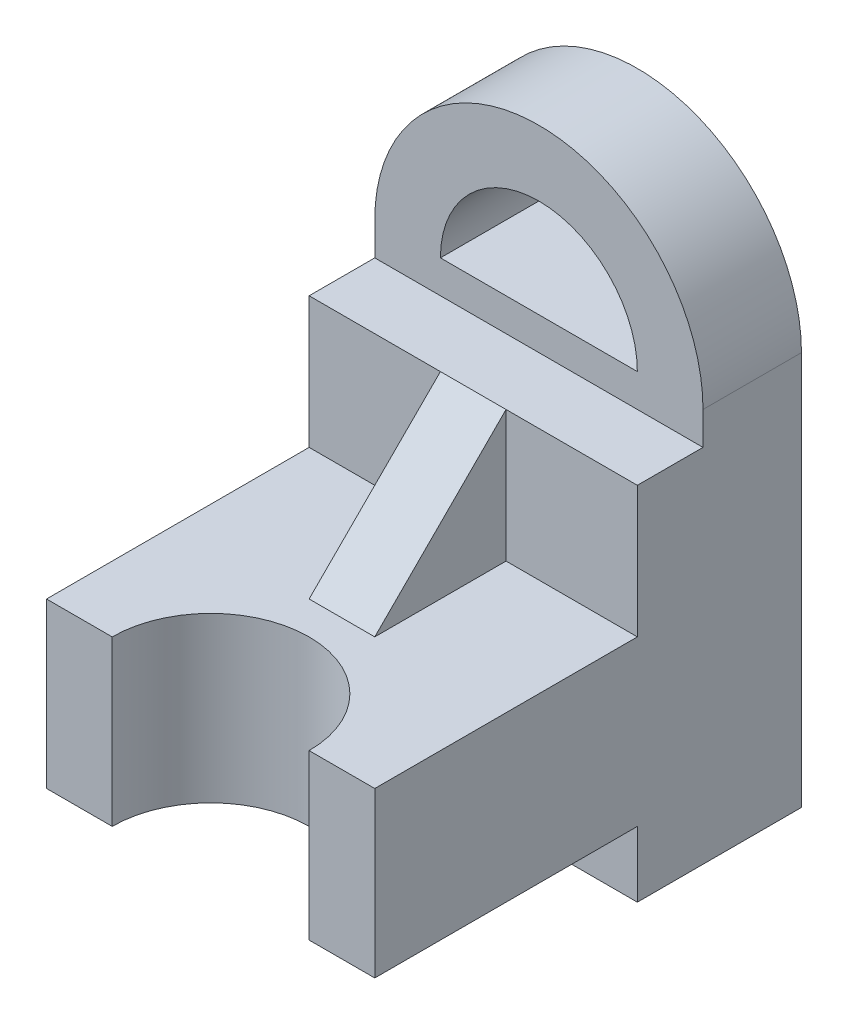
ISO-10303-21;
HEADER;
FILE_DESCRIPTION(('STEP AP214'),'2;1');
FILE_NAME('part.step','',(''),(''),'','','');
FILE_SCHEMA(('AUTOMOTIVE_DESIGN { 1 0 10303 214 1 1 1 1 }'));
ENDSEC;
DATA;
#1=APPLICATION_CONTEXT('core data for automotive mechanical design processes');
#2=APPLICATION_PROTOCOL_DEFINITION('international standard','automotive_design',2000,#1);
#3=PRODUCT_CONTEXT('',#1,'mechanical');
#4=PRODUCT('Part','Part','',(#3));
#5=PRODUCT_RELATED_PRODUCT_CATEGORY('part','',(#4));
#6=PRODUCT_DEFINITION_FORMATION('','',#4);
#7=PRODUCT_DEFINITION_CONTEXT('part definition',#1,'design');
#8=PRODUCT_DEFINITION('design','',#6,#7);
#9=PRODUCT_DEFINITION_SHAPE('','',#8);
#10=(LENGTH_UNIT() NAMED_UNIT(*) SI_UNIT(.MILLI.,.METRE.));
#11=(NAMED_UNIT(*) PLANE_ANGLE_UNIT() SI_UNIT($,.RADIAN.));
#12=(NAMED_UNIT(*) SI_UNIT($,.STERADIAN.) SOLID_ANGLE_UNIT());
#13=UNCERTAINTY_MEASURE_WITH_UNIT(LENGTH_MEASURE(1.E-05),#10,'distance_accuracy_value','');
#14=(GEOMETRIC_REPRESENTATION_CONTEXT(3) GLOBAL_UNCERTAINTY_ASSIGNED_CONTEXT((#13)) GLOBAL_UNIT_ASSIGNED_CONTEXT((#10,
#11,#12)) REPRESENTATION_CONTEXT('',''));
#15=CARTESIAN_POINT('',(0.,0.,0.));
#16=DIRECTION('',(0.,0.,1.));
#17=DIRECTION('',(1.,0.,0.));
#18=AXIS2_PLACEMENT_3D('',#15,#16,#17);
#19=CARTESIAN_POINT('',(0.,0.,25.));
#20=DIRECTION('',(0.,0.,1.));
#21=DIRECTION('',(1.,0.,0.));
#22=AXIS2_PLACEMENT_3D('',#19,#20,#21);
#23=PLANE('',#22);
#24=DIRECTION('',(1.,0.,0.));
#25=VECTOR('',#24,1.);
#26=CARTESIAN_POINT('',(0.,20.,25.));
#27=LINE('',#26,#25);
#28=CARTESIAN_POINT('',(5.,20.,25.));
#29=VERTEX_POINT('',#28);
#30=CARTESIAN_POINT('',(25.,20.,25.));
#31=VERTEX_POINT('',#30);
#32=EDGE_CURVE('E188',#29,#31,#27,.T.);
#33=ORIENTED_EDGE('',*,*,#32,.F.);
#34=DIRECTION('',(0.,1.,0.));
#35=VECTOR('',#34,1.);
#36=CARTESIAN_POINT('',(5.,0.,25.));
#37=LINE('',#36,#35);
#38=CARTESIAN_POINT('',(5.,0.,25.));
#39=VERTEX_POINT('',#38);
#40=EDGE_CURVE('E176',#39,#29,#37,.T.);
#41=ORIENTED_EDGE('',*,*,#40,.F.);
#42=DIRECTION('',(-1.,0.,0.));
#43=VECTOR('',#42,1.);
#44=CARTESIAN_POINT('',(0.,0.,25.));
#45=LINE('',#44,#43);
#46=CARTESIAN_POINT('',(25.,0.,25.));
#47=VERTEX_POINT('',#46);
#48=EDGE_CURVE('E276',#47,#39,#45,.T.);
#49=ORIENTED_EDGE('',*,*,#48,.F.);
#50=DIRECTION('',(0.,-1.,0.));
#51=VECTOR('',#50,1.);
#52=CARTESIAN_POINT('',(25.,0.,25.));
#53=LINE('',#52,#51);
#54=EDGE_CURVE('E189',#31,#47,#53,.T.);
#55=ORIENTED_EDGE('',*,*,#54,.F.);
#56=EDGE_LOOP('',(#33,#41,#49,#55));
#57=FACE_BOUND('',#56,.T.);
#58=ADVANCED_FACE('F45',(#57),#23,.T.);
#59=CARTESIAN_POINT('',(0.,0.,65.));
#60=DIRECTION('',(0.,-1.,0.));
#61=DIRECTION('',(1.,0.,0.));
#62=AXIS2_PLACEMENT_3D('',#59,#60,#61);
#63=PLANE('',#62);
#64=DIRECTION('',(0.,0.,-1.));
#65=VECTOR('',#64,1.);
#66=CARTESIAN_POINT('',(5.,0.,45.));
#67=LINE('',#66,#65);
#68=CARTESIAN_POINT('',(5.,0.,45.));
#69=VERTEX_POINT('',#68);
#70=EDGE_CURVE('E175',#69,#39,#67,.T.);
#71=ORIENTED_EDGE('',*,*,#70,.F.);
#72=DIRECTION('',(-1.,0.,0.));
#73=VECTOR('',#72,1.);
#74=CARTESIAN_POINT('',(5.,0.,45.));
#75=LINE('',#74,#73);
#76=CARTESIAN_POINT('',(-5.,0.,45.));
#77=VERTEX_POINT('',#76);
#78=EDGE_CURVE('E171',#69,#77,#75,.T.);
#79=ORIENTED_EDGE('',*,*,#78,.T.);
#80=DIRECTION('',(0.,0.,-1.));
#81=VECTOR('',#80,1.);
#82=CARTESIAN_POINT('',(-5.,0.,45.));
#83=LINE('',#82,#81);
#84=CARTESIAN_POINT('',(-5.,0.,25.));
#85=VERTEX_POINT('',#84);
#86=EDGE_CURVE('E185',#77,#85,#83,.T.);
#87=ORIENTED_EDGE('',*,*,#86,.T.);
#88=CARTESIAN_POINT('',(-25.,0.,25.));
#89=VERTEX_POINT('',#88);
#90=EDGE_CURVE('E275',#85,#89,#45,.T.);
#91=ORIENTED_EDGE('',*,*,#90,.T.);
#92=DIRECTION('',(0.,0.,-1.));
#93=VECTOR('',#92,1.);
#94=CARTESIAN_POINT('',(-25.,0.,65.));
#95=LINE('',#94,#93);
#96=CARTESIAN_POINT('',(-25.,0.,65.));
#97=VERTEX_POINT('',#96);
#98=EDGE_CURVE('E256',#97,#89,#95,.T.);
#99=ORIENTED_EDGE('',*,*,#98,.F.);
#100=DIRECTION('',(-1.,0.,0.));
#101=VECTOR('',#100,1.);
#102=CARTESIAN_POINT('',(0.,0.,65.));
#103=LINE('',#102,#101);
#104=CARTESIAN_POINT('',(-15.,0.,65.));
#105=VERTEX_POINT('',#104);
#106=EDGE_CURVE('E244',#105,#97,#103,.T.);
#107=ORIENTED_EDGE('',*,*,#106,.F.);
#108=CARTESIAN_POINT('',(0.,0.,65.));
#109=DIRECTION('',(0.,-1.,0.));
#110=DIRECTION('',(1.,0.,0.));
#111=AXIS2_PLACEMENT_3D('',#108,#109,#110);
#112=CIRCLE('',#111,15.);
#113=CARTESIAN_POINT('',(15.,0.,65.));
#114=VERTEX_POINT('',#113);
#115=EDGE_CURVE('E68',#105,#114,#112,.T.);
#116=ORIENTED_EDGE('',*,*,#115,.T.);
#117=CARTESIAN_POINT('',(25.,0.,65.));
#118=VERTEX_POINT('',#117);
#119=EDGE_CURVE('E245',#118,#114,#103,.T.);
#120=ORIENTED_EDGE('',*,*,#119,.F.);
#121=DIRECTION('',(0.,0.,-1.));
#122=VECTOR('',#121,1.);
#123=CARTESIAN_POINT('',(25.,0.,65.));
#124=LINE('',#123,#122);
#125=EDGE_CURVE('E260',#118,#47,#124,.T.);
#126=ORIENTED_EDGE('',*,*,#125,.T.);
#127=ORIENTED_EDGE('',*,*,#48,.T.);
#128=EDGE_LOOP('',(#71,#79,#87,#91,#99,#107,#116,#120,#126,#127));
#129=FACE_BOUND('',#128,.T.);
#130=ADVANCED_FACE('F373',(#129),#63,.F.);
#131=CARTESIAN_POINT('',(0.,0.,65.));
#132=DIRECTION('',(0.,0.,1.));
#133=DIRECTION('',(1.,0.,0.));
#134=AXIS2_PLACEMENT_3D('',#131,#132,#133);
#135=PLANE('',#134);
#136=DIRECTION('',(0.,1.,0.));
#137=VECTOR('',#136,1.);
#138=CARTESIAN_POINT('',(15.,-35.,65.));
#139=LINE('',#138,#137);
#140=CARTESIAN_POINT('',(15.,-25.,65.));
#141=VERTEX_POINT('',#140);
#142=EDGE_CURVE('E11',#141,#114,#139,.T.);
#143=ORIENTED_EDGE('',*,*,#142,.F.);
#144=DIRECTION('',(1.,0.,0.));
#145=VECTOR('',#144,1.);
#146=CARTESIAN_POINT('',(0.,-25.,65.));
#147=LINE('',#146,#145);
#148=CARTESIAN_POINT('',(25.,-25.,65.));
#149=VERTEX_POINT('',#148);
#150=EDGE_CURVE('E236',#141,#149,#147,.T.);
#151=ORIENTED_EDGE('',*,*,#150,.T.);
#152=DIRECTION('',(0.,1.,0.));
#153=VECTOR('',#152,1.);
#154=CARTESIAN_POINT('',(25.,0.,65.));
#155=LINE('',#154,#153);
#156=EDGE_CURVE('E241',#149,#118,#155,.T.);
#157=ORIENTED_EDGE('',*,*,#156,.T.);
#158=ORIENTED_EDGE('',*,*,#119,.T.);
#159=EDGE_LOOP('',(#143,#151,#157,#158));
#160=FACE_BOUND('',#159,.T.);
#161=ADVANCED_FACE('F366',(#160),#135,.T.);
#162=CARTESIAN_POINT('',(0.,25.,15.));
#163=DIRECTION('',(0.,-1.,0.));
#164=DIRECTION('',(1.,0.,0.));
#165=AXIS2_PLACEMENT_3D('',#162,#163,#164);
#166=PLANE('',#165);
#167=DIRECTION('',(-1.,0.,0.));
#168=VECTOR('',#167,1.);
#169=CARTESIAN_POINT('',(0.,25.,0.));
#170=LINE('',#169,#168);
#171=CARTESIAN_POINT('',(15.,25.,0.));
#172=VERTEX_POINT('',#171);
#173=CARTESIAN_POINT('',(-15.,25.,0.));
#174=VERTEX_POINT('',#173);
#175=EDGE_CURVE('E322',#172,#174,#170,.T.);
#176=ORIENTED_EDGE('',*,*,#175,.T.);
#177=DIRECTION('',(0.,0.,-1.));
#178=VECTOR('',#177,1.);
#179=CARTESIAN_POINT('',(-15.,25.,15.));
#180=LINE('',#179,#178);
#181=CARTESIAN_POINT('',(-15.,25.,15.));
#182=VERTEX_POINT('',#181);
#183=EDGE_CURVE('E332',#182,#174,#180,.T.);
#184=ORIENTED_EDGE('',*,*,#183,.F.);
#185=DIRECTION('',(-1.,0.,0.));
#186=VECTOR('',#185,1.);
#187=CARTESIAN_POINT('',(0.,25.,15.));
#188=LINE('',#187,#186);
#189=CARTESIAN_POINT('',(15.,25.,15.));
#190=VERTEX_POINT('',#189);
#191=EDGE_CURVE('E304',#190,#182,#188,.T.);
#192=ORIENTED_EDGE('',*,*,#191,.F.);
#193=DIRECTION('',(0.,0.,-1.));
#194=VECTOR('',#193,1.);
#195=CARTESIAN_POINT('',(15.,25.,15.));
#196=LINE('',#195,#194);
#197=EDGE_CURVE('E328',#190,#172,#196,.T.);
#198=ORIENTED_EDGE('',*,*,#197,.T.);
#199=EDGE_LOOP('',(#176,#184,#192,#198));
#200=FACE_BOUND('',#199,.T.);
#201=ADVANCED_FACE('F432',(#200),#166,.F.);
#202=CARTESIAN_POINT('',(0.,25.,15.));
#203=DIRECTION('',(0.,0.,-1.));
#204=DIRECTION('',(-1.,0.,0.));
#205=AXIS2_PLACEMENT_3D('',#202,#203,#204);
#206=CYLINDRICAL_SURFACE('',#205,25.);
#207=CARTESIAN_POINT('',(0.,25.,0.));
#208=DIRECTION('',(0.,0.,1.));
#209=DIRECTION('',(1.,0.,0.));
#210=AXIS2_PLACEMENT_3D('',#207,#208,#209);
#211=CIRCLE('',#210,25.);
#212=CARTESIAN_POINT('',(-25.,25.,0.));
#213=VERTEX_POINT('',#212);
#214=CARTESIAN_POINT('',(25.,25.,0.));
#215=VERTEX_POINT('',#214);
#216=EDGE_CURVE('E286',#213,#215,#211,.F.);
#217=ORIENTED_EDGE('',*,*,#216,.F.);
#218=DIRECTION('',(0.,0.,-1.));
#219=VECTOR('',#218,1.);
#220=CARTESIAN_POINT('',(-25.,25.,15.));
#221=LINE('',#220,#219);
#222=CARTESIAN_POINT('',(-25.,25.,15.));
#223=VERTEX_POINT('',#222);
#224=EDGE_CURVE('E333',#223,#213,#221,.T.);
#225=ORIENTED_EDGE('',*,*,#224,.F.);
#226=CARTESIAN_POINT('',(0.,25.,15.));
#227=DIRECTION('',(0.,0.,1.));
#228=DIRECTION('',(1.,0.,0.));
#229=AXIS2_PLACEMENT_3D('',#226,#227,#228);
#230=CIRCLE('',#229,25.);
#231=CARTESIAN_POINT('',(25.,25.,15.));
#232=VERTEX_POINT('',#231);
#233=EDGE_CURVE('E287',#223,#232,#230,.F.);
#234=ORIENTED_EDGE('',*,*,#233,.T.);
#235=DIRECTION('',(0.,0.,-1.));
#236=VECTOR('',#235,1.);
#237=CARTESIAN_POINT('',(25.,25.,15.));
#238=LINE('',#237,#236);
#239=EDGE_CURVE('E311',#232,#215,#238,.T.);
#240=ORIENTED_EDGE('',*,*,#239,.T.);
#241=EDGE_LOOP('',(#217,#225,#234,#240));
#242=FACE_BOUND('',#241,.T.);
#243=ADVANCED_FACE('F47',(#242),#206,.T.);
#244=CARTESIAN_POINT('',(-24.9999999999999,0.,15.));
#245=DIRECTION('',(-1.,0.,0.));
#246=DIRECTION('',(0.,-1.,0.));
#247=AXIS2_PLACEMENT_3D('',#244,#245,#246);
#248=PLANE('',#247);
#249=DIRECTION('',(0.,1.,0.));
#250=VECTOR('',#249,1.);
#251=CARTESIAN_POINT('',(-24.9999999999999,0.,0.));
#252=LINE('',#251,#250);
#253=CARTESIAN_POINT('',(-25.,-35.,0.));
#254=VERTEX_POINT('',#253);
#255=EDGE_CURVE('E315',#254,#213,#252,.T.);
#256=ORIENTED_EDGE('',*,*,#255,.F.);
#257=DIRECTION('',(0.,0.,-1.));
#258=VECTOR('',#257,1.);
#259=CARTESIAN_POINT('',(-25.,-35.,25.));
#260=LINE('',#259,#258);
#261=CARTESIAN_POINT('',(-25.,-35.,25.));
#262=VERTEX_POINT('',#261);
#263=EDGE_CURVE('E225',#262,#254,#260,.T.);
#264=ORIENTED_EDGE('',*,*,#263,.F.);
#265=DIRECTION('',(0.,-1.,0.));
#266=VECTOR('',#265,1.);
#267=CARTESIAN_POINT('',(-25.,0.,25.));
#268=LINE('',#267,#266);
#269=CARTESIAN_POINT('',(-25.,-25.,25.));
#270=VERTEX_POINT('',#269);
#271=EDGE_CURVE('E222',#270,#262,#268,.T.);
#272=ORIENTED_EDGE('',*,*,#271,.F.);
#273=DIRECTION('',(0.,0.,-1.));
#274=VECTOR('',#273,1.);
#275=CARTESIAN_POINT('',(-25.,-25.,65.));
#276=LINE('',#275,#274);
#277=CARTESIAN_POINT('',(-25.,-25.,65.));
#278=VERTEX_POINT('',#277);
#279=EDGE_CURVE('E252',#278,#270,#276,.T.);
#280=ORIENTED_EDGE('',*,*,#279,.F.);
#281=DIRECTION('',(0.,-1.,0.));
#282=VECTOR('',#281,1.);
#283=CARTESIAN_POINT('',(-25.,0.,65.));
#284=LINE('',#283,#282);
#285=EDGE_CURVE('E249',#97,#278,#284,.T.);
#286=ORIENTED_EDGE('',*,*,#285,.F.);
#287=ORIENTED_EDGE('',*,*,#98,.T.);
#288=DIRECTION('',(0.,1.,0.));
#289=VECTOR('',#288,1.);
#290=CARTESIAN_POINT('',(-25.,0.,25.));
#291=LINE('',#290,#289);
#292=CARTESIAN_POINT('',(-25.,20.,25.));
#293=VERTEX_POINT('',#292);
#294=EDGE_CURVE('E271',#89,#293,#291,.T.);
#295=ORIENTED_EDGE('',*,*,#294,.T.);
#296=DIRECTION('',(0.,0.,-1.));
#297=VECTOR('',#296,1.);
#298=CARTESIAN_POINT('',(-25.,20.,25.));
#299=LINE('',#298,#297);
#300=CARTESIAN_POINT('',(-25.,20.,15.));
#301=VERTEX_POINT('',#300);
#302=EDGE_CURVE('E279',#293,#301,#299,.T.);
#303=ORIENTED_EDGE('',*,*,#302,.T.);
#304=DIRECTION('',(0.,1.,0.));
#305=VECTOR('',#304,1.);
#306=CARTESIAN_POINT('',(-24.9999999999999,0.,15.));
#307=LINE('',#306,#305);
#308=EDGE_CURVE('E291',#301,#223,#307,.T.);
#309=ORIENTED_EDGE('',*,*,#308,.T.);
#310=ORIENTED_EDGE('',*,*,#224,.T.);
#311=EDGE_LOOP('',(#256,#264,#272,#280,#286,#287,#295,#303,#309,#310));
#312=FACE_BOUND('',#311,.T.);
#313=ADVANCED_FACE('F355',(#312),#248,.T.);
#314=CARTESIAN_POINT('',(25.,0.,15.));
#315=DIRECTION('',(1.,0.,0.));
#316=DIRECTION('',(0.,1.,0.));
#317=AXIS2_PLACEMENT_3D('',#314,#315,#316);
#318=PLANE('',#317);
#319=DIRECTION('',(0.,-1.,0.));
#320=VECTOR('',#319,1.);
#321=CARTESIAN_POINT('',(25.,0.,0.));
#322=LINE('',#321,#320);
#323=CARTESIAN_POINT('',(25.,-35.,0.));
#324=VERTEX_POINT('',#323);
#325=EDGE_CURVE('E319',#215,#324,#322,.T.);
#326=ORIENTED_EDGE('',*,*,#325,.F.);
#327=ORIENTED_EDGE('',*,*,#239,.F.);
#328=DIRECTION('',(0.,-1.,0.));
#329=VECTOR('',#328,1.);
#330=CARTESIAN_POINT('',(25.,0.,15.));
#331=LINE('',#330,#329);
#332=CARTESIAN_POINT('',(25.,20.,15.));
#333=VERTEX_POINT('',#332);
#334=EDGE_CURVE('E300',#232,#333,#331,.T.);
#335=ORIENTED_EDGE('',*,*,#334,.T.);
#336=DIRECTION('',(0.,0.,-1.));
#337=VECTOR('',#336,1.);
#338=CARTESIAN_POINT('',(25.,20.,25.));
#339=LINE('',#338,#337);
#340=EDGE_CURVE('E283',#31,#333,#339,.T.);
#341=ORIENTED_EDGE('',*,*,#340,.F.);
#342=ORIENTED_EDGE('',*,*,#54,.T.);
#343=ORIENTED_EDGE('',*,*,#125,.F.);
#344=ORIENTED_EDGE('',*,*,#156,.F.);
#345=DIRECTION('',(0.,0.,-1.));
#346=VECTOR('',#345,1.);
#347=CARTESIAN_POINT('',(25.,-25.,65.));
#348=LINE('',#347,#346);
#349=CARTESIAN_POINT('',(25.,-25.,25.));
#350=VERTEX_POINT('',#349);
#351=EDGE_CURVE('E264',#149,#350,#348,.T.);
#352=ORIENTED_EDGE('',*,*,#351,.T.);
#353=DIRECTION('',(0.,1.,0.));
#354=VECTOR('',#353,1.);
#355=CARTESIAN_POINT('',(25.,0.,25.));
#356=LINE('',#355,#354);
#357=CARTESIAN_POINT('',(25.,-35.,25.));
#358=VERTEX_POINT('',#357);
#359=EDGE_CURVE('E215',#358,#350,#356,.T.);
#360=ORIENTED_EDGE('',*,*,#359,.F.);
#361=DIRECTION('',(0.,0.,-1.));
#362=VECTOR('',#361,1.);
#363=CARTESIAN_POINT('',(25.,-35.,25.));
#364=LINE('',#363,#362);
#365=EDGE_CURVE('E232',#358,#324,#364,.T.);
#366=ORIENTED_EDGE('',*,*,#365,.T.);
#367=EDGE_LOOP('',(#326,#327,#335,#341,#342,#343,#344,#352,#360,#366));
#368=FACE_BOUND('',#367,.T.);
#369=ADVANCED_FACE('F362',(#368),#318,.T.);
#370=CARTESIAN_POINT('',(0.,25.,15.));
#371=DIRECTION('',(0.,0.,-1.));
#372=DIRECTION('',(-1.,0.,0.));
#373=AXIS2_PLACEMENT_3D('',#370,#371,#372);
#374=CYLINDRICAL_SURFACE('',#373,15.);
#375=CARTESIAN_POINT('',(0.,25.,0.));
#376=DIRECTION('',(0.,0.,1.));
#377=DIRECTION('',(1.,0.,0.));
#378=AXIS2_PLACEMENT_3D('',#375,#376,#377);
#379=CIRCLE('',#378,15.);
#380=EDGE_CURVE('E292',#174,#172,#379,.F.);
#381=ORIENTED_EDGE('',*,*,#380,.T.);
#382=ORIENTED_EDGE('',*,*,#197,.F.);
#383=CARTESIAN_POINT('',(0.,25.,15.));
#384=DIRECTION('',(0.,0.,1.));
#385=DIRECTION('',(1.,0.,0.));
#386=AXIS2_PLACEMENT_3D('',#383,#384,#385);
#387=CIRCLE('',#386,15.);
#388=EDGE_CURVE('E308',#182,#190,#387,.F.);
#389=ORIENTED_EDGE('',*,*,#388,.F.);
#390=ORIENTED_EDGE('',*,*,#183,.T.);
#391=EDGE_LOOP('',(#381,#382,#389,#390));
#392=FACE_BOUND('',#391,.T.);
#393=ADVANCED_FACE('F427',(#392),#374,.F.);
#394=CARTESIAN_POINT('',(0.,0.,15.));
#395=DIRECTION('',(0.,0.,1.));
#396=DIRECTION('',(1.,0.,0.));
#397=AXIS2_PLACEMENT_3D('',#394,#395,#396);
#398=PLANE('',#397);
#399=ORIENTED_EDGE('',*,*,#233,.F.);
#400=ORIENTED_EDGE('',*,*,#308,.F.);
#401=DIRECTION('',(1.,0.,0.));
#402=VECTOR('',#401,1.);
#403=CARTESIAN_POINT('',(0.,20.,15.));
#404=LINE('',#403,#402);
#405=EDGE_CURVE('E296',#301,#333,#404,.T.);
#406=ORIENTED_EDGE('',*,*,#405,.T.);
#407=ORIENTED_EDGE('',*,*,#334,.F.);
#408=EDGE_LOOP('',(#399,#400,#406,#407));
#409=FACE_BOUND('',#408,.T.);
#410=ORIENTED_EDGE('',*,*,#191,.T.);
#411=ORIENTED_EDGE('',*,*,#388,.T.);
#412=EDGE_LOOP('',(#410,#411));
#413=FACE_BOUND('',#412,.T.);
#414=ADVANCED_FACE('F379',(#409,#413),#398,.T.);
#415=CARTESIAN_POINT('',(0.,0.,0.));
#416=DIRECTION('',(0.,0.,1.));
#417=DIRECTION('',(1.,0.,0.));
#418=AXIS2_PLACEMENT_3D('',#415,#416,#417);
#419=PLANE('',#418);
#420=ORIENTED_EDGE('',*,*,#216,.T.);
#421=ORIENTED_EDGE('',*,*,#325,.T.);
#422=DIRECTION('',(1.,0.,0.));
#423=VECTOR('',#422,1.);
#424=CARTESIAN_POINT('',(0.,-35.,0.));
#425=LINE('',#424,#423);
#426=EDGE_CURVE('E210',#254,#324,#425,.T.);
#427=ORIENTED_EDGE('',*,*,#426,.F.);
#428=ORIENTED_EDGE('',*,*,#255,.T.);
#429=EDGE_LOOP('',(#420,#421,#427,#428));
#430=FACE_BOUND('',#429,.T.);
#431=ORIENTED_EDGE('',*,*,#175,.F.);
#432=ORIENTED_EDGE('',*,*,#380,.F.);
#433=EDGE_LOOP('',(#431,#432));
#434=FACE_BOUND('',#433,.T.);
#435=ADVANCED_FACE('F390',(#430,#434),#419,.F.);
#436=CARTESIAN_POINT('',(0.,20.,25.));
#437=DIRECTION('',(0.,1.,0.));
#438=DIRECTION('',(-1.,0.,0.));
#439=AXIS2_PLACEMENT_3D('',#436,#437,#438);
#440=PLANE('',#439);
#441=ORIENTED_EDGE('',*,*,#405,.F.);
#442=ORIENTED_EDGE('',*,*,#302,.F.);
#443=CARTESIAN_POINT('',(-5.,20.,25.));
#444=VERTEX_POINT('',#443);
#445=EDGE_CURVE('E193',#293,#444,#27,.T.);
#446=ORIENTED_EDGE('',*,*,#445,.T.);
#447=DIRECTION('',(-1.,0.,0.));
#448=VECTOR('',#447,1.);
#449=CARTESIAN_POINT('',(5.,20.,25.));
#450=LINE('',#449,#448);
#451=EDGE_CURVE('E169',#29,#444,#450,.T.);
#452=ORIENTED_EDGE('',*,*,#451,.F.);
#453=ORIENTED_EDGE('',*,*,#32,.T.);
#454=ORIENTED_EDGE('',*,*,#340,.T.);
#455=EDGE_LOOP('',(#441,#442,#446,#452,#453,#454));
#456=FACE_BOUND('',#455,.T.);
#457=ADVANCED_FACE('F196',(#456),#440,.T.);
#458=DIRECTION('',(0.,1.,0.));
#459=VECTOR('',#458,1.);
#460=CARTESIAN_POINT('',(-5.,0.,25.));
#461=LINE('',#460,#459);
#462=EDGE_CURVE('E61',#85,#444,#461,.T.);
#463=ORIENTED_EDGE('',*,*,#462,.T.);
#464=ORIENTED_EDGE('',*,*,#445,.F.);
#465=ORIENTED_EDGE('',*,*,#294,.F.);
#466=ORIENTED_EDGE('',*,*,#90,.F.);
#467=EDGE_LOOP('',(#463,#464,#465,#466));
#468=FACE_BOUND('',#467,.T.);
#469=ADVANCED_FACE('F375',(#468),#23,.T.);
#470=CARTESIAN_POINT('',(0.,-25.,65.));
#471=DIRECTION('',(0.,1.,0.));
#472=DIRECTION('',(-1.,0.,0.));
#473=AXIS2_PLACEMENT_3D('',#470,#471,#472);
#474=PLANE('',#473);
#475=ORIENTED_EDGE('',*,*,#150,.F.);
#476=CARTESIAN_POINT('',(0.,-25.,65.));
#477=DIRECTION('',(0.,1.,0.));
#478=DIRECTION('',(-1.,0.,0.));
#479=AXIS2_PLACEMENT_3D('',#476,#477,#478);
#480=CIRCLE('',#479,15.);
#481=CARTESIAN_POINT('',(-15.,-25.,65.));
#482=VERTEX_POINT('',#481);
#483=EDGE_CURVE('E199',#141,#482,#480,.T.);
#484=ORIENTED_EDGE('',*,*,#483,.T.);
#485=EDGE_CURVE('E237',#278,#482,#147,.T.);
#486=ORIENTED_EDGE('',*,*,#485,.F.);
#487=ORIENTED_EDGE('',*,*,#279,.T.);
#488=DIRECTION('',(1.,0.,0.));
#489=VECTOR('',#488,1.);
#490=CARTESIAN_POINT('',(0.,-25.,25.));
#491=LINE('',#490,#489);
#492=EDGE_CURVE('E218',#270,#350,#491,.T.);
#493=ORIENTED_EDGE('',*,*,#492,.T.);
#494=ORIENTED_EDGE('',*,*,#351,.F.);
#495=EDGE_LOOP('',(#475,#484,#486,#487,#493,#494));
#496=FACE_BOUND('',#495,.T.);
#497=ADVANCED_FACE('F348',(#496),#474,.F.);
#498=DIRECTION('',(0.,1.,0.));
#499=VECTOR('',#498,1.);
#500=CARTESIAN_POINT('',(-15.,-35.,65.));
#501=LINE('',#500,#499);
#502=EDGE_CURVE('E54',#105,#482,#501,.F.);
#503=ORIENTED_EDGE('',*,*,#502,.F.);
#504=ORIENTED_EDGE('',*,*,#106,.T.);
#505=ORIENTED_EDGE('',*,*,#285,.T.);
#506=ORIENTED_EDGE('',*,*,#485,.T.);
#507=EDGE_LOOP('',(#503,#504,#505,#506));
#508=FACE_BOUND('',#507,.T.);
#509=ADVANCED_FACE('F350',(#508),#135,.T.);
#510=CARTESIAN_POINT('',(0.,-35.,25.));
#511=DIRECTION('',(0.,1.,0.));
#512=DIRECTION('',(-1.,0.,0.));
#513=AXIS2_PLACEMENT_3D('',#510,#511,#512);
#514=PLANE('',#513);
#515=ORIENTED_EDGE('',*,*,#426,.T.);
#516=ORIENTED_EDGE('',*,*,#365,.F.);
#517=DIRECTION('',(1.,0.,0.));
#518=VECTOR('',#517,1.);
#519=CARTESIAN_POINT('',(0.,-35.,25.));
#520=LINE('',#519,#518);
#521=EDGE_CURVE('E211',#262,#358,#520,.T.);
#522=ORIENTED_EDGE('',*,*,#521,.F.);
#523=ORIENTED_EDGE('',*,*,#263,.T.);
#524=EDGE_LOOP('',(#515,#516,#522,#523));
#525=FACE_BOUND('',#524,.T.);
#526=ADVANCED_FACE('F388',(#525),#514,.F.);
#527=CARTESIAN_POINT('',(0.,0.,25.));
#528=DIRECTION('',(0.,0.,1.));
#529=DIRECTION('',(1.,0.,0.));
#530=AXIS2_PLACEMENT_3D('',#527,#528,#529);
#531=PLANE('',#530);
#532=ORIENTED_EDGE('',*,*,#521,.T.);
#533=ORIENTED_EDGE('',*,*,#359,.T.);
#534=ORIENTED_EDGE('',*,*,#492,.F.);
#535=ORIENTED_EDGE('',*,*,#271,.T.);
#536=EDGE_LOOP('',(#532,#533,#534,#535));
#537=FACE_BOUND('',#536,.T.);
#538=ADVANCED_FACE('F513',(#537),#531,.T.);
#539=CARTESIAN_POINT('',(0.,-35.,65.));
#540=DIRECTION('',(0.,1.,0.));
#541=DIRECTION('',(0.,0.,1.));
#542=AXIS2_PLACEMENT_3D('',#539,#540,#541);
#543=CYLINDRICAL_SURFACE('',#542,15.);
#544=ORIENTED_EDGE('',*,*,#502,.T.);
#545=ORIENTED_EDGE('',*,*,#483,.F.);
#546=ORIENTED_EDGE('',*,*,#142,.T.);
#547=ORIENTED_EDGE('',*,*,#115,.F.);
#548=EDGE_LOOP('',(#544,#545,#546,#547));
#549=FACE_BOUND('',#548,.T.);
#550=ADVANCED_FACE('F341',(#549),#543,.F.);
#551=CARTESIAN_POINT('',(5.,20.,25.));
#552=DIRECTION('',(0.,-0.707106781186548,-0.707106781186548));
#553=DIRECTION('',(0.,0.707106781186548,-0.707106781186548));
#554=AXIS2_PLACEMENT_3D('',#551,#552,#553);
#555=PLANE('',#554);
#556=DIRECTION('',(0.,-0.707106781186548,0.707106781186548));
#557=VECTOR('',#556,1.);
#558=CARTESIAN_POINT('',(-5.,20.,25.));
#559=LINE('',#558,#557);
#560=EDGE_CURVE('E397',#444,#77,#559,.T.);
#561=ORIENTED_EDGE('',*,*,#560,.T.);
#562=ORIENTED_EDGE('',*,*,#78,.F.);
#563=DIRECTION('',(0.,-0.707106781186548,0.707106781186548));
#564=VECTOR('',#563,1.);
#565=CARTESIAN_POINT('',(5.,20.,25.));
#566=LINE('',#565,#564);
#567=EDGE_CURVE('E165',#29,#69,#566,.T.);
#568=ORIENTED_EDGE('',*,*,#567,.F.);
#569=ORIENTED_EDGE('',*,*,#451,.T.);
#570=EDGE_LOOP('',(#561,#562,#568,#569));
#571=FACE_BOUND('',#570,.T.);
#572=ADVANCED_FACE('F167',(#571),#555,.F.);
#573=CARTESIAN_POINT('',(5.,0.,0.));
#574=DIRECTION('',(-1.,0.,0.));
#575=DIRECTION('',(0.,0.,1.));
#576=AXIS2_PLACEMENT_3D('',#573,#574,#575);
#577=PLANE('',#576);
#578=ORIENTED_EDGE('',*,*,#40,.T.);
#579=ORIENTED_EDGE('',*,*,#567,.T.);
#580=ORIENTED_EDGE('',*,*,#70,.T.);
#581=EDGE_LOOP('',(#578,#579,#580));
#582=FACE_BOUND('',#581,.T.);
#583=ADVANCED_FACE('F180',(#582),#577,.F.);
#584=CARTESIAN_POINT('',(-5.,0.,0.));
#585=DIRECTION('',(-1.,0.,0.));
#586=DIRECTION('',(0.,0.,1.));
#587=AXIS2_PLACEMENT_3D('',#584,#585,#586);
#588=PLANE('',#587);
#589=ORIENTED_EDGE('',*,*,#462,.F.);
#590=ORIENTED_EDGE('',*,*,#86,.F.);
#591=ORIENTED_EDGE('',*,*,#560,.F.);
#592=EDGE_LOOP('',(#589,#590,#591));
#593=FACE_BOUND('',#592,.T.);
#594=ADVANCED_FACE('F400',(#593),#588,.T.);
#595=CLOSED_SHELL('',(#58,#130,#161,#201,#243,#313,#369,#393,#414,#435,#457,#469,#497,#509,#526,
#538,#550,#572,#583,#594));
#596=MANIFOLD_SOLID_BREP('B2',#595);
#597=ADVANCED_BREP_SHAPE_REPRESENTATION('',(#18,#596),#14);
#598=SHAPE_DEFINITION_REPRESENTATION(#9,#597);
ENDSEC;
END-ISO-10303-21;
